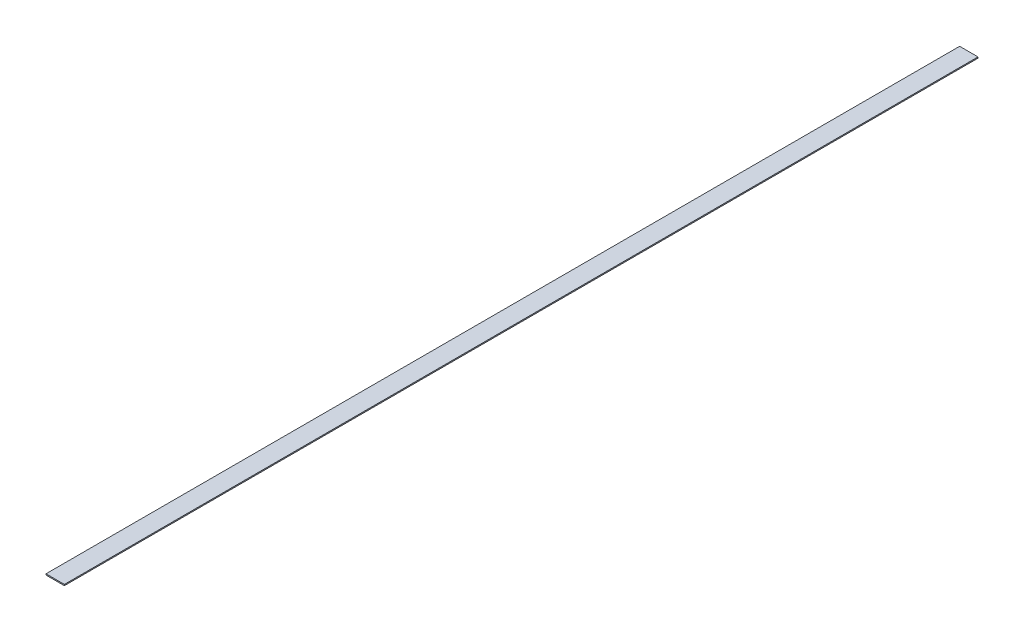
ISO-10303-21;
HEADER;
FILE_DESCRIPTION(('STEP AP214'),'2;1');
FILE_NAME('part.step','',(''),(''),'','','');
FILE_SCHEMA(('AUTOMOTIVE_DESIGN { 1 0 10303 214 1 1 1 1 }'));
ENDSEC;
DATA;
#1=APPLICATION_CONTEXT('core data for automotive mechanical design processes');
#2=APPLICATION_PROTOCOL_DEFINITION('international standard','automotive_design',2000,#1);
#3=PRODUCT_CONTEXT('',#1,'mechanical');
#4=PRODUCT('Part','Part','',(#3));
#5=PRODUCT_RELATED_PRODUCT_CATEGORY('part','',(#4));
#6=PRODUCT_DEFINITION_FORMATION('','',#4);
#7=PRODUCT_DEFINITION_CONTEXT('part definition',#1,'design');
#8=PRODUCT_DEFINITION('design','',#6,#7);
#9=PRODUCT_DEFINITION_SHAPE('','',#8);
#10=(LENGTH_UNIT() NAMED_UNIT(*) SI_UNIT(.MILLI.,.METRE.));
#11=(NAMED_UNIT(*) PLANE_ANGLE_UNIT() SI_UNIT($,.RADIAN.));
#12=(NAMED_UNIT(*) SI_UNIT($,.STERADIAN.) SOLID_ANGLE_UNIT());
#13=UNCERTAINTY_MEASURE_WITH_UNIT(LENGTH_MEASURE(1.E-05),#10,'distance_accuracy_value','');
#14=(GEOMETRIC_REPRESENTATION_CONTEXT(3) GLOBAL_UNCERTAINTY_ASSIGNED_CONTEXT((#13)) GLOBAL_UNIT_ASSIGNED_CONTEXT((#10,
#11,#12)) REPRESENTATION_CONTEXT('',''));
#15=CARTESIAN_POINT('',(0.,0.,0.));
#16=DIRECTION('',(0.,0.,1.));
#17=DIRECTION('',(1.,0.,0.));
#18=AXIS2_PLACEMENT_3D('',#15,#16,#17);
#19=CARTESIAN_POINT('',(0.,3.175,0.));
#20=DIRECTION('',(1.,0.,0.));
#21=DIRECTION('',(0.,0.,-1.));
#22=AXIS2_PLACEMENT_3D('',#19,#20,#21);
#23=PLANE('',#22);
#24=DIRECTION('',(0.,0.,1.));
#25=VECTOR('',#24,1.);
#26=CARTESIAN_POINT('',(0.,0.,0.));
#27=LINE('',#26,#25);
#28=CARTESIAN_POINT('',(0.,0.,-2526.03));
#29=VERTEX_POINT('',#28);
#30=CARTESIAN_POINT('',(0.,0.,0.));
#31=VERTEX_POINT('',#30);
#32=EDGE_CURVE('E95',#29,#31,#27,.T.);
#33=ORIENTED_EDGE('',*,*,#32,.T.);
#34=DIRECTION('',(0.,-1.,0.));
#35=VECTOR('',#34,1.);
#36=CARTESIAN_POINT('',(0.,3.175,0.));
#37=LINE('',#36,#35);
#38=CARTESIAN_POINT('',(0.,3.175,0.));
#39=VERTEX_POINT('',#38);
#40=EDGE_CURVE('E11',#39,#31,#37,.T.);
#41=ORIENTED_EDGE('',*,*,#40,.F.);
#42=DIRECTION('',(0.,0.,1.));
#43=VECTOR('',#42,1.);
#44=CARTESIAN_POINT('',(0.,3.175,0.));
#45=LINE('',#44,#43);
#46=CARTESIAN_POINT('',(0.,3.175,-2526.03));
#47=VERTEX_POINT('',#46);
#48=EDGE_CURVE('E83',#47,#39,#45,.T.);
#49=ORIENTED_EDGE('',*,*,#48,.F.);
#50=DIRECTION('',(0.,-1.,0.));
#51=VECTOR('',#50,1.);
#52=CARTESIAN_POINT('',(0.,3.175,-2526.03));
#53=LINE('',#52,#51);
#54=EDGE_CURVE('E91',#47,#29,#53,.T.);
#55=ORIENTED_EDGE('',*,*,#54,.T.);
#56=EDGE_LOOP('',(#33,#41,#49,#55));
#57=FACE_BOUND('',#56,.T.);
#58=ADVANCED_FACE('F32',(#57),#23,.F.);
#59=CARTESIAN_POINT('',(0.,3.175,0.));
#60=DIRECTION('',(0.,0.,-1.));
#61=DIRECTION('',(-1.,0.,0.));
#62=AXIS2_PLACEMENT_3D('',#59,#60,#61);
#63=PLANE('',#62);
#64=DIRECTION('',(1.,0.,0.));
#65=VECTOR('',#64,1.);
#66=CARTESIAN_POINT('',(0.,0.,0.));
#67=LINE('',#66,#65);
#68=CARTESIAN_POINT('',(50.8,0.,0.));
#69=VERTEX_POINT('',#68);
#70=EDGE_CURVE('E87',#31,#69,#67,.T.);
#71=ORIENTED_EDGE('',*,*,#70,.T.);
#72=DIRECTION('',(0.,-1.,0.));
#73=VECTOR('',#72,1.);
#74=CARTESIAN_POINT('',(50.8,3.175,0.));
#75=LINE('',#74,#73);
#76=CARTESIAN_POINT('',(50.8,3.175,0.));
#77=VERTEX_POINT('',#76);
#78=EDGE_CURVE('E40',#77,#69,#75,.T.);
#79=ORIENTED_EDGE('',*,*,#78,.F.);
#80=DIRECTION('',(1.,0.,0.));
#81=VECTOR('',#80,1.);
#82=CARTESIAN_POINT('',(0.,3.175,0.));
#83=LINE('',#82,#81);
#84=EDGE_CURVE('E78',#39,#77,#83,.T.);
#85=ORIENTED_EDGE('',*,*,#84,.F.);
#86=ORIENTED_EDGE('',*,*,#40,.T.);
#87=EDGE_LOOP('',(#71,#79,#85,#86));
#88=FACE_BOUND('',#87,.T.);
#89=ADVANCED_FACE('F86',(#88),#63,.F.);
#90=CARTESIAN_POINT('',(50.8,3.175,0.));
#91=DIRECTION('',(-1.,0.,0.));
#92=DIRECTION('',(0.,0.,1.));
#93=AXIS2_PLACEMENT_3D('',#90,#91,#92);
#94=PLANE('',#93);
#95=DIRECTION('',(0.,0.,-1.));
#96=VECTOR('',#95,1.);
#97=CARTESIAN_POINT('',(50.8,0.,0.));
#98=LINE('',#97,#96);
#99=CARTESIAN_POINT('',(50.8,0.,-2526.03));
#100=VERTEX_POINT('',#99);
#101=EDGE_CURVE('E65',#69,#100,#98,.T.);
#102=ORIENTED_EDGE('',*,*,#101,.T.);
#103=DIRECTION('',(0.,-1.,0.));
#104=VECTOR('',#103,1.);
#105=CARTESIAN_POINT('',(50.8,3.175,-2526.03));
#106=LINE('',#105,#104);
#107=CARTESIAN_POINT('',(50.8,3.175,-2526.03));
#108=VERTEX_POINT('',#107);
#109=EDGE_CURVE('E88',#108,#100,#106,.T.);
#110=ORIENTED_EDGE('',*,*,#109,.F.);
#111=DIRECTION('',(0.,0.,-1.));
#112=VECTOR('',#111,1.);
#113=CARTESIAN_POINT('',(50.8,3.175,0.));
#114=LINE('',#113,#112);
#115=EDGE_CURVE('E81',#77,#108,#114,.T.);
#116=ORIENTED_EDGE('',*,*,#115,.F.);
#117=ORIENTED_EDGE('',*,*,#78,.T.);
#118=EDGE_LOOP('',(#102,#110,#116,#117));
#119=FACE_BOUND('',#118,.T.);
#120=ADVANCED_FACE('F89',(#119),#94,.F.);
#121=CARTESIAN_POINT('',(0.,3.175,-2526.03));
#122=DIRECTION('',(0.,0.,1.));
#123=DIRECTION('',(1.,0.,0.));
#124=AXIS2_PLACEMENT_3D('',#121,#122,#123);
#125=PLANE('',#124);
#126=DIRECTION('',(-1.,0.,0.));
#127=VECTOR('',#126,1.);
#128=CARTESIAN_POINT('',(0.,0.,-2526.03));
#129=LINE('',#128,#127);
#130=EDGE_CURVE('E71',#100,#29,#129,.T.);
#131=ORIENTED_EDGE('',*,*,#130,.T.);
#132=ORIENTED_EDGE('',*,*,#54,.F.);
#133=DIRECTION('',(-1.,0.,0.));
#134=VECTOR('',#133,1.);
#135=CARTESIAN_POINT('',(0.,3.175,-2526.03));
#136=LINE('',#135,#134);
#137=EDGE_CURVE('E48',#108,#47,#136,.T.);
#138=ORIENTED_EDGE('',*,*,#137,.F.);
#139=ORIENTED_EDGE('',*,*,#109,.T.);
#140=EDGE_LOOP('',(#131,#132,#138,#139));
#141=FACE_BOUND('',#140,.T.);
#142=ADVANCED_FACE('F102',(#141),#125,.F.);
#143=CARTESIAN_POINT('',(0.,3.175,0.));
#144=DIRECTION('',(0.,-1.,0.));
#145=DIRECTION('',(0.,0.,-1.));
#146=AXIS2_PLACEMENT_3D('',#143,#144,#145);
#147=PLANE('',#146);
#148=ORIENTED_EDGE('',*,*,#48,.T.);
#149=ORIENTED_EDGE('',*,*,#84,.T.);
#150=ORIENTED_EDGE('',*,*,#115,.T.);
#151=ORIENTED_EDGE('',*,*,#137,.T.);
#152=EDGE_LOOP('',(#148,#149,#150,#151));
#153=FACE_BOUND('',#152,.T.);
#154=ADVANCED_FACE('F79',(#153),#147,.F.);
#155=CARTESIAN_POINT('',(0.,0.,0.));
#156=DIRECTION('',(0.,-1.,0.));
#157=DIRECTION('',(0.,0.,-1.));
#158=AXIS2_PLACEMENT_3D('',#155,#156,#157);
#159=PLANE('',#158);
#160=ORIENTED_EDGE('',*,*,#32,.F.);
#161=ORIENTED_EDGE('',*,*,#130,.F.);
#162=ORIENTED_EDGE('',*,*,#101,.F.);
#163=ORIENTED_EDGE('',*,*,#70,.F.);
#164=EDGE_LOOP('',(#160,#161,#162,#163));
#165=FACE_BOUND('',#164,.T.);
#166=ADVANCED_FACE('F105',(#165),#159,.T.);
#167=CLOSED_SHELL('',(#58,#89,#120,#142,#154,#166));
#168=MANIFOLD_SOLID_BREP('B2',#167);
#169=ADVANCED_BREP_SHAPE_REPRESENTATION('',(#18,#168),#14);
#170=SHAPE_DEFINITION_REPRESENTATION(#9,#169);
ENDSEC;
END-ISO-10303-21;
